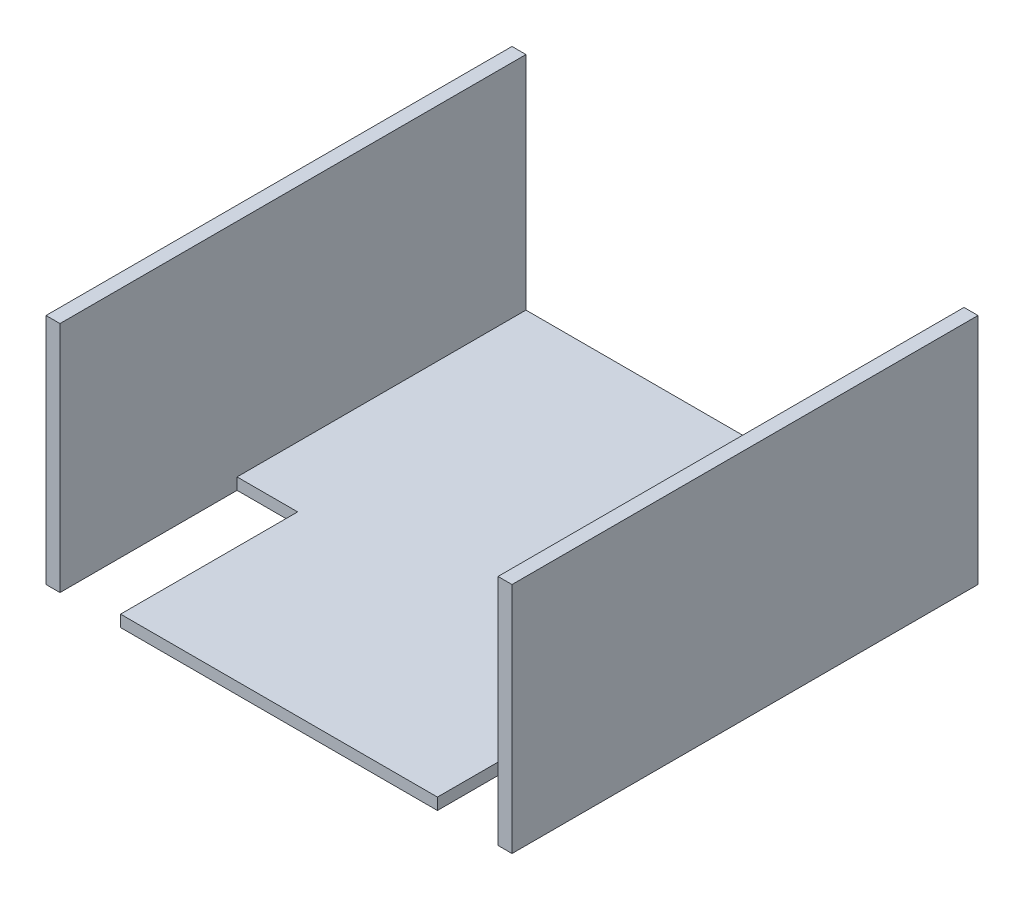
ISO-10303-21;
HEADER;
FILE_DESCRIPTION(('STEP AP214'),'2;1');
FILE_NAME('part.step','',(''),(''),'','','');
FILE_SCHEMA(('AUTOMOTIVE_DESIGN { 1 0 10303 214 1 1 1 1 }'));
ENDSEC;
DATA;
#1=APPLICATION_CONTEXT('core data for automotive mechanical design processes');
#2=APPLICATION_PROTOCOL_DEFINITION('international standard','automotive_design',2000,#1);
#3=PRODUCT_CONTEXT('',#1,'mechanical');
#4=PRODUCT('Part','Part','',(#3));
#5=PRODUCT_RELATED_PRODUCT_CATEGORY('part','',(#4));
#6=PRODUCT_DEFINITION_FORMATION('','',#4);
#7=PRODUCT_DEFINITION_CONTEXT('part definition',#1,'design');
#8=PRODUCT_DEFINITION('design','',#6,#7);
#9=PRODUCT_DEFINITION_SHAPE('','',#8);
#10=(LENGTH_UNIT() NAMED_UNIT(*) SI_UNIT(.MILLI.,.METRE.));
#11=(NAMED_UNIT(*) PLANE_ANGLE_UNIT() SI_UNIT($,.RADIAN.));
#12=(NAMED_UNIT(*) SI_UNIT($,.STERADIAN.) SOLID_ANGLE_UNIT());
#13=UNCERTAINTY_MEASURE_WITH_UNIT(LENGTH_MEASURE(1.E-05),#10,'distance_accuracy_value','');
#14=(GEOMETRIC_REPRESENTATION_CONTEXT(3) GLOBAL_UNCERTAINTY_ASSIGNED_CONTEXT((#13)) GLOBAL_UNIT_ASSIGNED_CONTEXT((#10,
#11,#12)) REPRESENTATION_CONTEXT('',''));
#15=CARTESIAN_POINT('',(0.,0.,0.));
#16=DIRECTION('',(0.,0.,1.));
#17=DIRECTION('',(1.,0.,0.));
#18=AXIS2_PLACEMENT_3D('',#15,#16,#17);
#19=CARTESIAN_POINT('',(0.,0.,0.));
#20=DIRECTION('',(0.,0.,1.));
#21=DIRECTION('',(1.,0.,0.));
#22=AXIS2_PLACEMENT_3D('',#19,#20,#21);
#23=PLANE('',#22);
#24=DIRECTION('',(-1.,0.,0.));
#25=VECTOR('',#24,1.);
#26=CARTESIAN_POINT('',(50.,0.,0.));
#27=LINE('',#26,#25);
#28=CARTESIAN_POINT('',(-47.,0.,0.));
#29=VERTEX_POINT('',#28);
#30=CARTESIAN_POINT('',(-50.,0.,0.));
#31=VERTEX_POINT('',#30);
#32=EDGE_CURVE('E182',#29,#31,#27,.T.);
#33=ORIENTED_EDGE('',*,*,#32,.F.);
#34=DIRECTION('',(0.,-1.,0.));
#35=VECTOR('',#34,1.);
#36=CARTESIAN_POINT('',(-47.,50.,0.));
#37=LINE('',#36,#35);
#38=CARTESIAN_POINT('',(-47.,50.,0.));
#39=VERTEX_POINT('',#38);
#40=EDGE_CURVE('E165',#39,#29,#37,.T.);
#41=ORIENTED_EDGE('',*,*,#40,.F.);
#42=DIRECTION('',(1.,0.,0.));
#43=VECTOR('',#42,1.);
#44=CARTESIAN_POINT('',(-50.,50.,0.));
#45=LINE('',#44,#43);
#46=CARTESIAN_POINT('',(-50.,50.,0.));
#47=VERTEX_POINT('',#46);
#48=EDGE_CURVE('E191',#47,#39,#45,.T.);
#49=ORIENTED_EDGE('',*,*,#48,.F.);
#50=DIRECTION('',(0.,1.,0.));
#51=VECTOR('',#50,1.);
#52=CARTESIAN_POINT('',(-50.,0.,0.));
#53=LINE('',#52,#51);
#54=EDGE_CURVE('E187',#31,#47,#53,.T.);
#55=ORIENTED_EDGE('',*,*,#54,.F.);
#56=EDGE_LOOP('',(#33,#41,#49,#55));
#57=FACE_BOUND('',#56,.T.);
#58=ADVANCED_FACE('F39',(#57),#23,.T.);
#59=DIRECTION('',(0.,-1.,0.));
#60=VECTOR('',#59,1.);
#61=CARTESIAN_POINT('',(47.,50.,0.));
#62=LINE('',#61,#60);
#63=CARTESIAN_POINT('',(47.,50.,0.));
#64=VERTEX_POINT('',#63);
#65=CARTESIAN_POINT('',(47.,0.,0.));
#66=VERTEX_POINT('',#65);
#67=EDGE_CURVE('E164',#64,#66,#62,.T.);
#68=ORIENTED_EDGE('',*,*,#67,.T.);
#69=CARTESIAN_POINT('',(50.,0.,0.));
#70=VERTEX_POINT('',#69);
#71=EDGE_CURVE('E183',#70,#66,#27,.T.);
#72=ORIENTED_EDGE('',*,*,#71,.F.);
#73=DIRECTION('',(0.,1.,0.));
#74=VECTOR('',#73,1.);
#75=CARTESIAN_POINT('',(50.,0.,0.));
#76=LINE('',#75,#74);
#77=CARTESIAN_POINT('',(50.,50.,0.));
#78=VERTEX_POINT('',#77);
#79=EDGE_CURVE('E178',#70,#78,#76,.T.);
#80=ORIENTED_EDGE('',*,*,#79,.T.);
#81=DIRECTION('',(-1.,0.,0.));
#82=VECTOR('',#81,1.);
#83=CARTESIAN_POINT('',(50.,50.,0.));
#84=LINE('',#83,#82);
#85=EDGE_CURVE('E169',#78,#64,#84,.T.);
#86=ORIENTED_EDGE('',*,*,#85,.T.);
#87=EDGE_LOOP('',(#68,#72,#80,#86));
#88=FACE_BOUND('',#87,.T.);
#89=ADVANCED_FACE('F338',(#88),#23,.T.);
#90=CARTESIAN_POINT('',(-47.,50.,-100.));
#91=DIRECTION('',(-1.,0.,0.));
#92=DIRECTION('',(0.,-1.,0.));
#93=AXIS2_PLACEMENT_3D('',#90,#91,#92);
#94=PLANE('',#93);
#95=ORIENTED_EDGE('',*,*,#40,.T.);
#96=DIRECTION('',(0.,0.,1.));
#97=VECTOR('',#96,1.);
#98=CARTESIAN_POINT('',(-47.,0.,-100.));
#99=LINE('',#98,#97);
#100=CARTESIAN_POINT('',(-47.,0.,-38.));
#101=VERTEX_POINT('',#100);
#102=EDGE_CURVE('E171',#101,#29,#99,.T.);
#103=ORIENTED_EDGE('',*,*,#102,.F.);
#104=DIRECTION('',(0.,1.,0.));
#105=VECTOR('',#104,1.);
#106=CARTESIAN_POINT('',(-47.,-7.5,-38.));
#107=LINE('',#106,#105);
#108=CARTESIAN_POINT('',(-47.,2.5,-38.));
#109=VERTEX_POINT('',#108);
#110=EDGE_CURVE('E256',#101,#109,#107,.T.);
#111=ORIENTED_EDGE('',*,*,#110,.T.);
#112=DIRECTION('',(0.,0.,1.));
#113=VECTOR('',#112,1.);
#114=CARTESIAN_POINT('',(-47.,2.5,-100.));
#115=LINE('',#114,#113);
#116=CARTESIAN_POINT('',(-47.,2.5,-100.));
#117=VERTEX_POINT('',#116);
#118=EDGE_CURVE('E221',#117,#109,#115,.T.);
#119=ORIENTED_EDGE('',*,*,#118,.F.);
#120=DIRECTION('',(0.,-1.,0.));
#121=VECTOR('',#120,1.);
#122=CARTESIAN_POINT('',(-47.,50.,-100.));
#123=LINE('',#122,#121);
#124=CARTESIAN_POINT('',(-47.,50.,-100.));
#125=VERTEX_POINT('',#124);
#126=EDGE_CURVE('E194',#125,#117,#123,.T.);
#127=ORIENTED_EDGE('',*,*,#126,.F.);
#128=DIRECTION('',(0.,0.,1.));
#129=VECTOR('',#128,1.);
#130=CARTESIAN_POINT('',(-47.,50.,-100.));
#131=LINE('',#130,#129);
#132=EDGE_CURVE('E195',#125,#39,#131,.T.);
#133=ORIENTED_EDGE('',*,*,#132,.T.);
#134=EDGE_LOOP('',(#95,#103,#111,#119,#127,#133));
#135=FACE_BOUND('',#134,.T.);
#136=ADVANCED_FACE('F41',(#135),#94,.F.);
#137=CARTESIAN_POINT('',(-47.,2.5,-100.));
#138=DIRECTION('',(0.,-1.,0.));
#139=DIRECTION('',(0.,0.,-1.));
#140=AXIS2_PLACEMENT_3D('',#137,#138,#139);
#141=PLANE('',#140);
#142=ORIENTED_EDGE('',*,*,#118,.T.);
#143=DIRECTION('',(-1.,0.,0.));
#144=VECTOR('',#143,1.);
#145=CARTESIAN_POINT('',(-47.,2.5,-38.));
#146=LINE('',#145,#144);
#147=CARTESIAN_POINT('',(-34.,2.5,-38.));
#148=VERTEX_POINT('',#147);
#149=EDGE_CURVE('E158',#148,#109,#146,.T.);
#150=ORIENTED_EDGE('',*,*,#149,.F.);
#151=DIRECTION('',(0.,0.,-1.));
#152=VECTOR('',#151,1.);
#153=CARTESIAN_POINT('',(-34.,2.5,0.));
#154=LINE('',#153,#152);
#155=CARTESIAN_POINT('',(-34.,2.5,0.));
#156=VERTEX_POINT('',#155);
#157=EDGE_CURVE('E143',#156,#148,#154,.T.);
#158=ORIENTED_EDGE('',*,*,#157,.F.);
#159=DIRECTION('',(1.,0.,0.));
#160=VECTOR('',#159,1.);
#161=CARTESIAN_POINT('',(-47.,2.5,0.));
#162=LINE('',#161,#160);
#163=CARTESIAN_POINT('',(34.,2.5,0.));
#164=VERTEX_POINT('',#163);
#165=EDGE_CURVE('E156',#156,#164,#162,.T.);
#166=ORIENTED_EDGE('',*,*,#165,.T.);
#167=DIRECTION('',(0.,0.,1.));
#168=VECTOR('',#167,1.);
#169=CARTESIAN_POINT('',(34.,2.5,0.));
#170=LINE('',#169,#168);
#171=CARTESIAN_POINT('',(34.,2.5,-38.));
#172=VERTEX_POINT('',#171);
#173=EDGE_CURVE('E55',#172,#164,#170,.T.);
#174=ORIENTED_EDGE('',*,*,#173,.F.);
#175=DIRECTION('',(-1.,0.,0.));
#176=VECTOR('',#175,1.);
#177=CARTESIAN_POINT('',(47.,2.5,-38.));
#178=LINE('',#177,#176);
#179=CARTESIAN_POINT('',(47.,2.5,-38.));
#180=VERTEX_POINT('',#179);
#181=EDGE_CURVE('E251',#180,#172,#178,.T.);
#182=ORIENTED_EDGE('',*,*,#181,.F.);
#183=DIRECTION('',(0.,0.,1.));
#184=VECTOR('',#183,1.);
#185=CARTESIAN_POINT('',(47.,2.5,-100.));
#186=LINE('',#185,#184);
#187=CARTESIAN_POINT('',(47.,2.5,-100.));
#188=VERTEX_POINT('',#187);
#189=EDGE_CURVE('E217',#188,#180,#186,.T.);
#190=ORIENTED_EDGE('',*,*,#189,.F.);
#191=DIRECTION('',(1.,0.,0.));
#192=VECTOR('',#191,1.);
#193=CARTESIAN_POINT('',(-47.,2.5,-100.));
#194=LINE('',#193,#192);
#195=EDGE_CURVE('E267',#117,#188,#194,.T.);
#196=ORIENTED_EDGE('',*,*,#195,.F.);
#197=EDGE_LOOP('',(#142,#150,#158,#166,#174,#182,#190,#196));
#198=FACE_BOUND('',#197,.T.);
#199=ADVANCED_FACE('F155',(#198),#141,.F.);
#200=CARTESIAN_POINT('',(47.,50.,-100.));
#201=DIRECTION('',(-1.,0.,0.));
#202=DIRECTION('',(0.,-1.,0.));
#203=AXIS2_PLACEMENT_3D('',#200,#201,#202);
#204=PLANE('',#203);
#205=ORIENTED_EDGE('',*,*,#67,.F.);
#206=DIRECTION('',(0.,0.,1.));
#207=VECTOR('',#206,1.);
#208=CARTESIAN_POINT('',(47.,50.,-100.));
#209=LINE('',#208,#207);
#210=CARTESIAN_POINT('',(47.,50.,-100.));
#211=VERTEX_POINT('',#210);
#212=EDGE_CURVE('E214',#211,#64,#209,.T.);
#213=ORIENTED_EDGE('',*,*,#212,.F.);
#214=DIRECTION('',(0.,-1.,0.));
#215=VECTOR('',#214,1.);
#216=CARTESIAN_POINT('',(47.,50.,-100.));
#217=LINE('',#216,#215);
#218=EDGE_CURVE('E270',#211,#188,#217,.T.);
#219=ORIENTED_EDGE('',*,*,#218,.T.);
#220=ORIENTED_EDGE('',*,*,#189,.T.);
#221=DIRECTION('',(0.,1.,0.));
#222=VECTOR('',#221,1.);
#223=CARTESIAN_POINT('',(47.,-7.5,-38.));
#224=LINE('',#223,#222);
#225=CARTESIAN_POINT('',(47.,0.,-38.));
#226=VERTEX_POINT('',#225);
#227=EDGE_CURVE('E239',#226,#180,#224,.T.);
#228=ORIENTED_EDGE('',*,*,#227,.F.);
#229=DIRECTION('',(0.,0.,-1.));
#230=VECTOR('',#229,1.);
#231=CARTESIAN_POINT('',(47.,0.,-100.));
#232=LINE('',#231,#230);
#233=EDGE_CURVE('E233',#66,#226,#232,.T.);
#234=ORIENTED_EDGE('',*,*,#233,.F.);
#235=EDGE_LOOP('',(#205,#213,#219,#220,#228,#234));
#236=FACE_BOUND('',#235,.T.);
#237=ADVANCED_FACE('F243',(#236),#204,.T.);
#238=CARTESIAN_POINT('',(50.,50.,-100.));
#239=DIRECTION('',(0.,1.,0.));
#240=DIRECTION('',(-1.,0.,0.));
#241=AXIS2_PLACEMENT_3D('',#238,#239,#240);
#242=PLANE('',#241);
#243=ORIENTED_EDGE('',*,*,#85,.F.);
#244=DIRECTION('',(0.,0.,1.));
#245=VECTOR('',#244,1.);
#246=CARTESIAN_POINT('',(50.,50.,-100.));
#247=LINE('',#246,#245);
#248=CARTESIAN_POINT('',(50.,50.,-100.));
#249=VERTEX_POINT('',#248);
#250=EDGE_CURVE('E211',#249,#78,#247,.T.);
#251=ORIENTED_EDGE('',*,*,#250,.F.);
#252=DIRECTION('',(-1.,0.,0.));
#253=VECTOR('',#252,1.);
#254=CARTESIAN_POINT('',(50.,50.,-100.));
#255=LINE('',#254,#253);
#256=EDGE_CURVE('E273',#249,#211,#255,.T.);
#257=ORIENTED_EDGE('',*,*,#256,.T.);
#258=ORIENTED_EDGE('',*,*,#212,.T.);
#259=EDGE_LOOP('',(#243,#251,#257,#258));
#260=FACE_BOUND('',#259,.T.);
#261=ADVANCED_FACE('F306',(#260),#242,.T.);
#262=CARTESIAN_POINT('',(50.,0.,-100.));
#263=DIRECTION('',(1.,0.,0.));
#264=DIRECTION('',(0.,0.,-1.));
#265=AXIS2_PLACEMENT_3D('',#262,#263,#264);
#266=PLANE('',#265);
#267=ORIENTED_EDGE('',*,*,#79,.F.);
#268=DIRECTION('',(0.,0.,1.));
#269=VECTOR('',#268,1.);
#270=CARTESIAN_POINT('',(50.,0.,-100.));
#271=LINE('',#270,#269);
#272=CARTESIAN_POINT('',(50.,0.,-100.));
#273=VERTEX_POINT('',#272);
#274=EDGE_CURVE('E208',#273,#70,#271,.T.);
#275=ORIENTED_EDGE('',*,*,#274,.F.);
#276=DIRECTION('',(0.,1.,0.));
#277=VECTOR('',#276,1.);
#278=CARTESIAN_POINT('',(50.,0.,-100.));
#279=LINE('',#278,#277);
#280=EDGE_CURVE('E277',#273,#249,#279,.T.);
#281=ORIENTED_EDGE('',*,*,#280,.T.);
#282=ORIENTED_EDGE('',*,*,#250,.T.);
#283=EDGE_LOOP('',(#267,#275,#281,#282));
#284=FACE_BOUND('',#283,.T.);
#285=ADVANCED_FACE('F309',(#284),#266,.T.);
#286=CARTESIAN_POINT('',(50.,0.,-100.));
#287=DIRECTION('',(0.,1.,0.));
#288=DIRECTION('',(-1.,0.,0.));
#289=AXIS2_PLACEMENT_3D('',#286,#287,#288);
#290=PLANE('',#289);
#291=DIRECTION('',(-1.,0.,0.));
#292=VECTOR('',#291,1.);
#293=CARTESIAN_POINT('',(50.,0.,-38.));
#294=LINE('',#293,#292);
#295=CARTESIAN_POINT('',(-34.,0.,-38.));
#296=VERTEX_POINT('',#295);
#297=EDGE_CURVE('E11',#296,#101,#294,.T.);
#298=ORIENTED_EDGE('',*,*,#297,.T.);
#299=ORIENTED_EDGE('',*,*,#102,.T.);
#300=ORIENTED_EDGE('',*,*,#32,.T.);
#301=DIRECTION('',(0.,0.,1.));
#302=VECTOR('',#301,1.);
#303=CARTESIAN_POINT('',(-50.,0.,-100.));
#304=LINE('',#303,#302);
#305=CARTESIAN_POINT('',(-50.,0.,-100.));
#306=VERTEX_POINT('',#305);
#307=EDGE_CURVE('E204',#306,#31,#304,.T.);
#308=ORIENTED_EDGE('',*,*,#307,.F.);
#309=DIRECTION('',(-1.,0.,0.));
#310=VECTOR('',#309,1.);
#311=CARTESIAN_POINT('',(50.,0.,-100.));
#312=LINE('',#311,#310);
#313=EDGE_CURVE('E281',#273,#306,#312,.T.);
#314=ORIENTED_EDGE('',*,*,#313,.F.);
#315=ORIENTED_EDGE('',*,*,#274,.T.);
#316=ORIENTED_EDGE('',*,*,#71,.T.);
#317=ORIENTED_EDGE('',*,*,#233,.T.);
#318=DIRECTION('',(-1.,0.,0.));
#319=VECTOR('',#318,1.);
#320=CARTESIAN_POINT('',(50.,0.,-38.));
#321=LINE('',#320,#319);
#322=CARTESIAN_POINT('',(34.,0.,-38.));
#323=VERTEX_POINT('',#322);
#324=EDGE_CURVE('E48',#226,#323,#321,.T.);
#325=ORIENTED_EDGE('',*,*,#324,.T.);
#326=DIRECTION('',(0.,0.,1.));
#327=VECTOR('',#326,1.);
#328=CARTESIAN_POINT('',(34.,0.,-100.));
#329=LINE('',#328,#327);
#330=CARTESIAN_POINT('',(34.,0.,0.));
#331=VERTEX_POINT('',#330);
#332=EDGE_CURVE('E231',#323,#331,#329,.T.);
#333=ORIENTED_EDGE('',*,*,#332,.T.);
#334=CARTESIAN_POINT('',(-34.,0.,0.));
#335=VERTEX_POINT('',#334);
#336=EDGE_CURVE('E188',#331,#335,#27,.T.);
#337=ORIENTED_EDGE('',*,*,#336,.T.);
#338=DIRECTION('',(0.,0.,-1.));
#339=VECTOR('',#338,1.);
#340=CARTESIAN_POINT('',(-34.,0.,-100.));
#341=LINE('',#340,#339);
#342=EDGE_CURVE('E63',#335,#296,#341,.T.);
#343=ORIENTED_EDGE('',*,*,#342,.T.);
#344=EDGE_LOOP('',(#298,#299,#300,#308,#314,#315,#316,#317,#325,#333,#337,#343));
#345=FACE_BOUND('',#344,.T.);
#346=ADVANCED_FACE('F230',(#345),#290,.F.);
#347=CARTESIAN_POINT('',(-50.,0.,-100.));
#348=DIRECTION('',(1.,0.,0.));
#349=DIRECTION('',(0.,0.,-1.));
#350=AXIS2_PLACEMENT_3D('',#347,#348,#349);
#351=PLANE('',#350);
#352=ORIENTED_EDGE('',*,*,#54,.T.);
#353=DIRECTION('',(0.,0.,1.));
#354=VECTOR('',#353,1.);
#355=CARTESIAN_POINT('',(-50.,50.,-100.));
#356=LINE('',#355,#354);
#357=CARTESIAN_POINT('',(-50.,50.,-100.));
#358=VERTEX_POINT('',#357);
#359=EDGE_CURVE('E199',#358,#47,#356,.T.);
#360=ORIENTED_EDGE('',*,*,#359,.F.);
#361=DIRECTION('',(0.,1.,0.));
#362=VECTOR('',#361,1.);
#363=CARTESIAN_POINT('',(-50.,0.,-100.));
#364=LINE('',#363,#362);
#365=EDGE_CURVE('E284',#306,#358,#364,.T.);
#366=ORIENTED_EDGE('',*,*,#365,.F.);
#367=ORIENTED_EDGE('',*,*,#307,.T.);
#368=EDGE_LOOP('',(#352,#360,#366,#367));
#369=FACE_BOUND('',#368,.T.);
#370=ADVANCED_FACE('F315',(#369),#351,.F.);
#371=CARTESIAN_POINT('',(-50.,50.,-100.));
#372=DIRECTION('',(0.,-1.,0.));
#373=DIRECTION('',(1.,0.,0.));
#374=AXIS2_PLACEMENT_3D('',#371,#372,#373);
#375=PLANE('',#374);
#376=ORIENTED_EDGE('',*,*,#48,.T.);
#377=ORIENTED_EDGE('',*,*,#132,.F.);
#378=DIRECTION('',(1.,0.,0.));
#379=VECTOR('',#378,1.);
#380=CARTESIAN_POINT('',(-50.,50.,-100.));
#381=LINE('',#380,#379);
#382=EDGE_CURVE('E200',#358,#125,#381,.T.);
#383=ORIENTED_EDGE('',*,*,#382,.F.);
#384=ORIENTED_EDGE('',*,*,#359,.T.);
#385=EDGE_LOOP('',(#376,#377,#383,#384));
#386=FACE_BOUND('',#385,.T.);
#387=ADVANCED_FACE('F296',(#386),#375,.F.);
#388=CARTESIAN_POINT('',(0.,0.,-100.));
#389=DIRECTION('',(0.,0.,1.));
#390=DIRECTION('',(1.,0.,0.));
#391=AXIS2_PLACEMENT_3D('',#388,#389,#390);
#392=PLANE('',#391);
#393=ORIENTED_EDGE('',*,*,#126,.T.);
#394=ORIENTED_EDGE('',*,*,#195,.T.);
#395=ORIENTED_EDGE('',*,*,#218,.F.);
#396=ORIENTED_EDGE('',*,*,#256,.F.);
#397=ORIENTED_EDGE('',*,*,#280,.F.);
#398=ORIENTED_EDGE('',*,*,#313,.T.);
#399=ORIENTED_EDGE('',*,*,#365,.T.);
#400=ORIENTED_EDGE('',*,*,#382,.T.);
#401=EDGE_LOOP('',(#393,#394,#395,#396,#397,#398,#399,#400));
#402=FACE_BOUND('',#401,.T.);
#403=ADVANCED_FACE('F290',(#402),#392,.F.);
#404=DIRECTION('',(0.,1.,0.));
#405=VECTOR('',#404,1.);
#406=CARTESIAN_POINT('',(-34.,0.,0.));
#407=LINE('',#406,#405);
#408=EDGE_CURVE('E140',#335,#156,#407,.T.);
#409=ORIENTED_EDGE('',*,*,#408,.F.);
#410=ORIENTED_EDGE('',*,*,#336,.F.);
#411=DIRECTION('',(0.,-1.,0.));
#412=VECTOR('',#411,1.);
#413=CARTESIAN_POINT('',(34.,0.,0.));
#414=LINE('',#413,#412);
#415=EDGE_CURVE('E150',#164,#331,#414,.T.);
#416=ORIENTED_EDGE('',*,*,#415,.F.);
#417=ORIENTED_EDGE('',*,*,#165,.F.);
#418=EDGE_LOOP('',(#409,#410,#416,#417));
#419=FACE_BOUND('',#418,.T.);
#420=ADVANCED_FACE('F162',(#419),#23,.T.);
#421=CARTESIAN_POINT('',(47.,-7.5,-38.));
#422=DIRECTION('',(0.,0.,-1.));
#423=DIRECTION('',(-1.,0.,0.));
#424=AXIS2_PLACEMENT_3D('',#421,#422,#423);
#425=PLANE('',#424);
#426=ORIENTED_EDGE('',*,*,#227,.T.);
#427=ORIENTED_EDGE('',*,*,#181,.T.);
#428=DIRECTION('',(0.,1.,0.));
#429=VECTOR('',#428,1.);
#430=CARTESIAN_POINT('',(34.,-7.5,-38.));
#431=LINE('',#430,#429);
#432=EDGE_CURVE('E160',#323,#172,#431,.T.);
#433=ORIENTED_EDGE('',*,*,#432,.F.);
#434=ORIENTED_EDGE('',*,*,#324,.F.);
#435=EDGE_LOOP('',(#426,#427,#433,#434));
#436=FACE_BOUND('',#435,.T.);
#437=ADVANCED_FACE('F237',(#436),#425,.F.);
#438=CARTESIAN_POINT('',(34.,-7.5,0.));
#439=DIRECTION('',(-1.,0.,0.));
#440=DIRECTION('',(0.,0.,1.));
#441=AXIS2_PLACEMENT_3D('',#438,#439,#440);
#442=PLANE('',#441);
#443=ORIENTED_EDGE('',*,*,#432,.T.);
#444=ORIENTED_EDGE('',*,*,#173,.T.);
#445=ORIENTED_EDGE('',*,*,#415,.T.);
#446=ORIENTED_EDGE('',*,*,#332,.F.);
#447=EDGE_LOOP('',(#443,#444,#445,#446));
#448=FACE_BOUND('',#447,.T.);
#449=ADVANCED_FACE('F329',(#448),#442,.F.);
#450=CARTESIAN_POINT('',(-47.,-7.5,-38.));
#451=DIRECTION('',(0.,0.,-1.));
#452=DIRECTION('',(-1.,0.,0.));
#453=AXIS2_PLACEMENT_3D('',#450,#451,#452);
#454=PLANE('',#453);
#455=DIRECTION('',(0.,1.,0.));
#456=VECTOR('',#455,1.);
#457=CARTESIAN_POINT('',(-34.,-7.5,-38.));
#458=LINE('',#457,#456);
#459=EDGE_CURVE('E319',#296,#148,#458,.T.);
#460=ORIENTED_EDGE('',*,*,#459,.T.);
#461=ORIENTED_EDGE('',*,*,#149,.T.);
#462=ORIENTED_EDGE('',*,*,#110,.F.);
#463=ORIENTED_EDGE('',*,*,#297,.F.);
#464=EDGE_LOOP('',(#460,#461,#462,#463));
#465=FACE_BOUND('',#464,.T.);
#466=ADVANCED_FACE('F318',(#465),#454,.F.);
#467=CARTESIAN_POINT('',(-34.,-7.5,0.));
#468=DIRECTION('',(1.,0.,0.));
#469=DIRECTION('',(0.,0.,-1.));
#470=AXIS2_PLACEMENT_3D('',#467,#468,#469);
#471=PLANE('',#470);
#472=ORIENTED_EDGE('',*,*,#408,.T.);
#473=ORIENTED_EDGE('',*,*,#157,.T.);
#474=ORIENTED_EDGE('',*,*,#459,.F.);
#475=ORIENTED_EDGE('',*,*,#342,.F.);
#476=EDGE_LOOP('',(#472,#473,#474,#475));
#477=FACE_BOUND('',#476,.T.);
#478=ADVANCED_FACE('F142',(#477),#471,.F.);
#479=CLOSED_SHELL('',(#58,#89,#136,#199,#237,#261,#285,#346,#370,#387,#403,#420,#437,#449,#466,#478));
#480=MANIFOLD_SOLID_BREP('B2',#479);
#481=ADVANCED_BREP_SHAPE_REPRESENTATION('',(#18,#480),#14);
#482=SHAPE_DEFINITION_REPRESENTATION(#9,#481);
ENDSEC;
END-ISO-10303-21;
